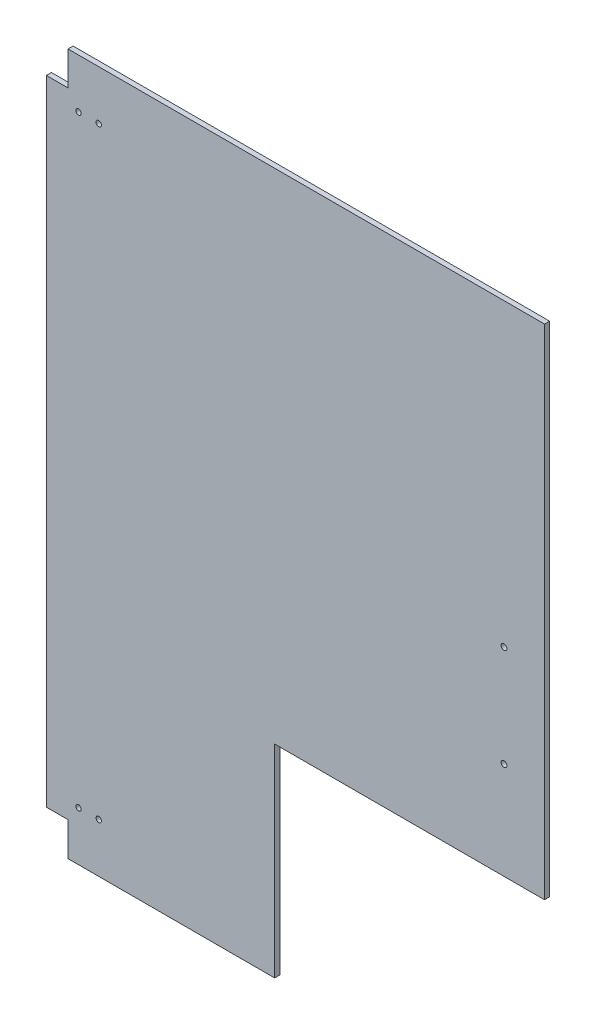
ISO-10303-21;
HEADER;
FILE_DESCRIPTION(('STEP AP214'),'2;1');
FILE_NAME('part.step','',(''),(''),'','','');
FILE_SCHEMA(('AUTOMOTIVE_DESIGN { 1 0 10303 214 1 1 1 1 }'));
ENDSEC;
DATA;
#1=APPLICATION_CONTEXT('core data for automotive mechanical design processes');
#2=APPLICATION_PROTOCOL_DEFINITION('international standard','automotive_design',2000,#1);
#3=PRODUCT_CONTEXT('',#1,'mechanical');
#4=PRODUCT('Part','Part','',(#3));
#5=PRODUCT_RELATED_PRODUCT_CATEGORY('part','',(#4));
#6=PRODUCT_DEFINITION_FORMATION('','',#4);
#7=PRODUCT_DEFINITION_CONTEXT('part definition',#1,'design');
#8=PRODUCT_DEFINITION('design','',#6,#7);
#9=PRODUCT_DEFINITION_SHAPE('','',#8);
#10=(LENGTH_UNIT() NAMED_UNIT(*) SI_UNIT(.MILLI.,.METRE.));
#11=(NAMED_UNIT(*) PLANE_ANGLE_UNIT() SI_UNIT($,.RADIAN.));
#12=(NAMED_UNIT(*) SI_UNIT($,.STERADIAN.) SOLID_ANGLE_UNIT());
#13=UNCERTAINTY_MEASURE_WITH_UNIT(LENGTH_MEASURE(1.E-05),#10,'distance_accuracy_value','');
#14=(GEOMETRIC_REPRESENTATION_CONTEXT(3) GLOBAL_UNCERTAINTY_ASSIGNED_CONTEXT((#13)) GLOBAL_UNIT_ASSIGNED_CONTEXT((#10,
#11,#12)) REPRESENTATION_CONTEXT('',''));
#15=CARTESIAN_POINT('',(0.,0.,0.));
#16=DIRECTION('',(0.,0.,1.));
#17=DIRECTION('',(1.,0.,0.));
#18=AXIS2_PLACEMENT_3D('',#15,#16,#17);
#19=CARTESIAN_POINT('',(0.,0.,3.));
#20=DIRECTION('',(0.,0.,-1.));
#21=DIRECTION('',(-1.,0.,0.));
#22=AXIS2_PLACEMENT_3D('',#19,#20,#21);
#23=PLANE('',#22);
#24=CARTESIAN_POINT('',(271.,238.45,3.));
#25=DIRECTION('',(0.,0.,1.));
#26=DIRECTION('',(1.,0.,0.));
#27=AXIS2_PLACEMENT_3D('',#24,#25,#26);
#28=CIRCLE('',#27,1.69999999999998);
#29=CARTESIAN_POINT('',(272.7,238.45,3.));
#30=VERTEX_POINT('',#29);
#31=EDGE_CURVE('E175',#30,#30,#28,.T.);
#32=ORIENTED_EDGE('',*,*,#31,.F.);
#33=EDGE_LOOP('',(#32));
#34=FACE_BOUND('',#33,.T.);
#35=CARTESIAN_POINT('',(271.,178.45,3.));
#36=DIRECTION('',(0.,0.,1.));
#37=DIRECTION('',(1.,0.,0.));
#38=AXIS2_PLACEMENT_3D('',#35,#36,#37);
#39=CIRCLE('',#38,1.69999999999998);
#40=CARTESIAN_POINT('',(272.7,178.45,3.));
#41=VERTEX_POINT('',#40);
#42=EDGE_CURVE('E221',#41,#41,#39,.T.);
#43=ORIENTED_EDGE('',*,*,#42,.F.);
#44=EDGE_LOOP('',(#43));
#45=FACE_BOUND('',#44,.T.);
#46=CARTESIAN_POINT('',(18.9999999999999,386.9,3.));
#47=DIRECTION('',(0.,0.,1.));
#48=DIRECTION('',(1.,0.,0.));
#49=AXIS2_PLACEMENT_3D('',#46,#47,#48);
#50=CIRCLE('',#49,1.6);
#51=CARTESIAN_POINT('',(20.5999999999999,386.9,3.));
#52=VERTEX_POINT('',#51);
#53=EDGE_CURVE('E225',#52,#52,#50,.T.);
#54=ORIENTED_EDGE('',*,*,#53,.F.);
#55=EDGE_LOOP('',(#54));
#56=FACE_BOUND('',#55,.T.);
#57=CARTESIAN_POINT('',(30.9999999999999,386.9,3.));
#58=DIRECTION('',(0.,0.,1.));
#59=DIRECTION('',(1.,0.,0.));
#60=AXIS2_PLACEMENT_3D('',#57,#58,#59);
#61=CIRCLE('',#60,1.6);
#62=CARTESIAN_POINT('',(32.5999999999999,386.9,3.));
#63=VERTEX_POINT('',#62);
#64=EDGE_CURVE('E229',#63,#63,#61,.T.);
#65=ORIENTED_EDGE('',*,*,#64,.F.);
#66=EDGE_LOOP('',(#65));
#67=FACE_BOUND('',#66,.T.);
#68=CARTESIAN_POINT('',(18.9999999999999,30.,3.));
#69=DIRECTION('',(0.,0.,1.));
#70=DIRECTION('',(1.,0.,0.));
#71=AXIS2_PLACEMENT_3D('',#68,#69,#70);
#72=CIRCLE('',#71,1.6);
#73=CARTESIAN_POINT('',(20.5999999999999,30.,3.));
#74=VERTEX_POINT('',#73);
#75=EDGE_CURVE('E233',#74,#74,#72,.T.);
#76=ORIENTED_EDGE('',*,*,#75,.F.);
#77=EDGE_LOOP('',(#76));
#78=FACE_BOUND('',#77,.T.);
#79=DIRECTION('',(1.,0.,0.));
#80=VECTOR('',#79,1.);
#81=CARTESIAN_POINT('',(0.,120.8,3.));
#82=LINE('',#81,#80);
#83=CARTESIAN_POINT('',(135.2,120.8,3.));
#84=VERTEX_POINT('',#83);
#85=CARTESIAN_POINT('',(295.,120.8,3.));
#86=VERTEX_POINT('',#85);
#87=EDGE_CURVE('E107',#84,#86,#82,.T.);
#88=ORIENTED_EDGE('',*,*,#87,.T.);
#89=DIRECTION('',(0.,-1.,0.));
#90=VECTOR('',#89,1.);
#91=CARTESIAN_POINT('',(295.,416.9,3.));
#92=LINE('',#91,#90);
#93=CARTESIAN_POINT('',(295.,416.1,3.));
#94=VERTEX_POINT('',#93);
#95=EDGE_CURVE('E94',#94,#86,#92,.T.);
#96=ORIENTED_EDGE('',*,*,#95,.F.);
#97=DIRECTION('',(-1.,0.,0.));
#98=VECTOR('',#97,1.);
#99=CARTESIAN_POINT('',(0.,416.1,3.));
#100=LINE('',#99,#98);
#101=CARTESIAN_POINT('',(12.7999999999999,416.1,3.));
#102=VERTEX_POINT('',#101);
#103=EDGE_CURVE('E103',#94,#102,#100,.T.);
#104=ORIENTED_EDGE('',*,*,#103,.T.);
#105=DIRECTION('',(0.,1.,0.));
#106=VECTOR('',#105,1.);
#107=CARTESIAN_POINT('',(12.7999999999999,416.9,3.));
#108=LINE('',#107,#106);
#109=CARTESIAN_POINT('',(12.7999999999999,396.1,3.));
#110=VERTEX_POINT('',#109);
#111=EDGE_CURVE('E124',#110,#102,#108,.T.);
#112=ORIENTED_EDGE('',*,*,#111,.F.);
#113=DIRECTION('',(1.,0.,0.));
#114=VECTOR('',#113,1.);
#115=CARTESIAN_POINT('',(-1.0842021724855E-13,396.1,3.));
#116=LINE('',#115,#114);
#117=CARTESIAN_POINT('',(-1.05483171037185E-13,396.1,3.));
#118=VERTEX_POINT('',#117);
#119=EDGE_CURVE('E126',#118,#110,#116,.T.);
#120=ORIENTED_EDGE('',*,*,#119,.F.);
#121=DIRECTION('',(0.,-1.,0.));
#122=VECTOR('',#121,1.);
#123=CARTESIAN_POINT('',(0.,0.,3.));
#124=LINE('',#123,#122);
#125=CARTESIAN_POINT('',(0.,20.8,3.));
#126=VERTEX_POINT('',#125);
#127=EDGE_CURVE('E140',#118,#126,#124,.T.);
#128=ORIENTED_EDGE('',*,*,#127,.T.);
#129=DIRECTION('',(-1.,0.,0.));
#130=VECTOR('',#129,1.);
#131=CARTESIAN_POINT('',(0.,20.8,3.));
#132=LINE('',#131,#130);
#133=CARTESIAN_POINT('',(12.8,20.8,3.));
#134=VERTEX_POINT('',#133);
#135=EDGE_CURVE('E166',#134,#126,#132,.T.);
#136=ORIENTED_EDGE('',*,*,#135,.F.);
#137=DIRECTION('',(0.,1.,0.));
#138=VECTOR('',#137,1.);
#139=CARTESIAN_POINT('',(12.8,0.,3.));
#140=LINE('',#139,#138);
#141=CARTESIAN_POINT('',(12.8,0.8,3.));
#142=VERTEX_POINT('',#141);
#143=EDGE_CURVE('E129',#142,#134,#140,.T.);
#144=ORIENTED_EDGE('',*,*,#143,.F.);
#145=DIRECTION('',(1.,0.,0.));
#146=VECTOR('',#145,1.);
#147=CARTESIAN_POINT('',(0.,0.8,3.));
#148=LINE('',#147,#146);
#149=CARTESIAN_POINT('',(135.2,0.8,3.));
#150=VERTEX_POINT('',#149);
#151=EDGE_CURVE('E143',#142,#150,#148,.T.);
#152=ORIENTED_EDGE('',*,*,#151,.T.);
#153=DIRECTION('',(0.,1.,0.));
#154=VECTOR('',#153,1.);
#155=CARTESIAN_POINT('',(135.2,0.,3.));
#156=LINE('',#155,#154);
#157=EDGE_CURVE('E118',#150,#84,#156,.T.);
#158=ORIENTED_EDGE('',*,*,#157,.T.);
#159=EDGE_LOOP('',(#88,#96,#104,#112,#120,#128,#136,#144,#152,#158));
#160=FACE_BOUND('',#159,.T.);
#161=CARTESIAN_POINT('',(30.9999999999999,30.,3.));
#162=DIRECTION('',(0.,0.,1.));
#163=DIRECTION('',(1.,0.,0.));
#164=AXIS2_PLACEMENT_3D('',#161,#162,#163);
#165=CIRCLE('',#164,1.6);
#166=CARTESIAN_POINT('',(32.5999999999999,30.,3.));
#167=VERTEX_POINT('',#166);
#168=EDGE_CURVE('E237',#167,#167,#165,.T.);
#169=ORIENTED_EDGE('',*,*,#168,.F.);
#170=EDGE_LOOP('',(#169));
#171=FACE_BOUND('',#170,.T.);
#172=ADVANCED_FACE('F42',(#34,#45,#56,#67,#78,#160,#171),#23,.F.);
#173=CARTESIAN_POINT('',(0.,0.,3.));
#174=DIRECTION('',(1.,0.,0.));
#175=DIRECTION('',(0.,1.,0.));
#176=AXIS2_PLACEMENT_3D('',#173,#174,#175);
#177=PLANE('',#176);
#178=ORIENTED_EDGE('',*,*,#127,.F.);
#179=DIRECTION('',(0.,0.,-1.));
#180=VECTOR('',#179,1.);
#181=CARTESIAN_POINT('',(-1.05483171037185E-13,396.1,3.));
#182=LINE('',#181,#180);
#183=CARTESIAN_POINT('',(-1.05483171037185E-13,396.1,0.));
#184=VERTEX_POINT('',#183);
#185=EDGE_CURVE('E130',#118,#184,#182,.T.);
#186=ORIENTED_EDGE('',*,*,#185,.T.);
#187=DIRECTION('',(0.,-1.,0.));
#188=VECTOR('',#187,1.);
#189=CARTESIAN_POINT('',(0.,0.,0.));
#190=LINE('',#189,#188);
#191=CARTESIAN_POINT('',(0.,20.8,0.));
#192=VERTEX_POINT('',#191);
#193=EDGE_CURVE('E133',#184,#192,#190,.T.);
#194=ORIENTED_EDGE('',*,*,#193,.T.);
#195=DIRECTION('',(0.,0.,1.));
#196=VECTOR('',#195,1.);
#197=CARTESIAN_POINT('',(0.,20.8,3.));
#198=LINE('',#197,#196);
#199=EDGE_CURVE('E134',#192,#126,#198,.T.);
#200=ORIENTED_EDGE('',*,*,#199,.T.);
#201=EDGE_LOOP('',(#178,#186,#194,#200));
#202=FACE_BOUND('',#201,.T.);
#203=ADVANCED_FACE('F186',(#202),#177,.F.);
#204=CARTESIAN_POINT('',(0.,0.8,3.));
#205=DIRECTION('',(0.,1.,0.));
#206=DIRECTION('',(0.,0.,1.));
#207=AXIS2_PLACEMENT_3D('',#204,#205,#206);
#208=PLANE('',#207);
#209=ORIENTED_EDGE('',*,*,#151,.F.);
#210=DIRECTION('',(0.,0.,1.));
#211=VECTOR('',#210,1.);
#212=CARTESIAN_POINT('',(12.8,0.8,-7.));
#213=LINE('',#212,#211);
#214=CARTESIAN_POINT('',(12.8,0.8,0.));
#215=VERTEX_POINT('',#214);
#216=EDGE_CURVE('E169',#215,#142,#213,.T.);
#217=ORIENTED_EDGE('',*,*,#216,.F.);
#218=DIRECTION('',(1.,0.,0.));
#219=VECTOR('',#218,1.);
#220=CARTESIAN_POINT('',(0.,0.8,0.));
#221=LINE('',#220,#219);
#222=CARTESIAN_POINT('',(135.2,0.8,0.));
#223=VERTEX_POINT('',#222);
#224=EDGE_CURVE('E151',#215,#223,#221,.T.);
#225=ORIENTED_EDGE('',*,*,#224,.T.);
#226=DIRECTION('',(0.,0.,-1.));
#227=VECTOR('',#226,1.);
#228=CARTESIAN_POINT('',(135.2,0.8,3.));
#229=LINE('',#228,#227);
#230=EDGE_CURVE('E116',#150,#223,#229,.T.);
#231=ORIENTED_EDGE('',*,*,#230,.F.);
#232=EDGE_LOOP('',(#209,#217,#225,#231));
#233=FACE_BOUND('',#232,.T.);
#234=ADVANCED_FACE('F212',(#233),#208,.F.);
#235=CARTESIAN_POINT('',(135.2,0.,3.));
#236=DIRECTION('',(-1.,0.,0.));
#237=DIRECTION('',(0.,0.,1.));
#238=AXIS2_PLACEMENT_3D('',#235,#236,#237);
#239=PLANE('',#238);
#240=DIRECTION('',(0.,1.,0.));
#241=VECTOR('',#240,1.);
#242=CARTESIAN_POINT('',(135.2,0.,0.));
#243=LINE('',#242,#241);
#244=CARTESIAN_POINT('',(135.2,120.8,0.));
#245=VERTEX_POINT('',#244);
#246=EDGE_CURVE('E146',#223,#245,#243,.T.);
#247=ORIENTED_EDGE('',*,*,#246,.T.);
#248=DIRECTION('',(0.,0.,-1.));
#249=VECTOR('',#248,1.);
#250=CARTESIAN_POINT('',(135.2,120.8,3.));
#251=LINE('',#250,#249);
#252=EDGE_CURVE('E113',#84,#245,#251,.T.);
#253=ORIENTED_EDGE('',*,*,#252,.F.);
#254=ORIENTED_EDGE('',*,*,#157,.F.);
#255=ORIENTED_EDGE('',*,*,#230,.T.);
#256=EDGE_LOOP('',(#247,#253,#254,#255));
#257=FACE_BOUND('',#256,.T.);
#258=ADVANCED_FACE('F291',(#257),#239,.F.);
#259=CARTESIAN_POINT('',(300.,120.8,3.));
#260=DIRECTION('',(0.,1.,0.));
#261=DIRECTION('',(0.,0.,1.));
#262=AXIS2_PLACEMENT_3D('',#259,#260,#261);
#263=PLANE('',#262);
#264=DIRECTION('',(1.,0.,0.));
#265=VECTOR('',#264,1.);
#266=CARTESIAN_POINT('',(0.,120.8,0.));
#267=LINE('',#266,#265);
#268=CARTESIAN_POINT('',(295.,120.8,0.));
#269=VERTEX_POINT('',#268);
#270=EDGE_CURVE('E141',#245,#269,#267,.T.);
#271=ORIENTED_EDGE('',*,*,#270,.T.);
#272=DIRECTION('',(0.,0.,1.));
#273=VECTOR('',#272,1.);
#274=CARTESIAN_POINT('',(295.,120.8,3.));
#275=LINE('',#274,#273);
#276=EDGE_CURVE('E60',#269,#86,#275,.T.);
#277=ORIENTED_EDGE('',*,*,#276,.T.);
#278=ORIENTED_EDGE('',*,*,#87,.F.);
#279=ORIENTED_EDGE('',*,*,#252,.T.);
#280=EDGE_LOOP('',(#271,#277,#278,#279));
#281=FACE_BOUND('',#280,.T.);
#282=ADVANCED_FACE('F288',(#281),#263,.F.);
#283=CARTESIAN_POINT('',(-1.11022302462516E-13,416.1,3.));
#284=DIRECTION('',(0.,-1.,0.));
#285=DIRECTION('',(0.,0.,-1.));
#286=AXIS2_PLACEMENT_3D('',#283,#284,#285);
#287=PLANE('',#286);
#288=ORIENTED_EDGE('',*,*,#103,.F.);
#289=DIRECTION('',(0.,0.,1.));
#290=VECTOR('',#289,1.);
#291=CARTESIAN_POINT('',(295.,416.1,-7.));
#292=LINE('',#291,#290);
#293=CARTESIAN_POINT('',(295.,416.1,0.));
#294=VERTEX_POINT('',#293);
#295=EDGE_CURVE('E46',#294,#94,#292,.T.);
#296=ORIENTED_EDGE('',*,*,#295,.F.);
#297=DIRECTION('',(-1.,0.,0.));
#298=VECTOR('',#297,1.);
#299=CARTESIAN_POINT('',(0.,416.1,0.));
#300=LINE('',#299,#298);
#301=CARTESIAN_POINT('',(12.7999999999999,416.1,0.));
#302=VERTEX_POINT('',#301);
#303=EDGE_CURVE('E139',#294,#302,#300,.T.);
#304=ORIENTED_EDGE('',*,*,#303,.T.);
#305=DIRECTION('',(0.,0.,1.));
#306=VECTOR('',#305,1.);
#307=CARTESIAN_POINT('',(12.7999999999999,416.1,3.));
#308=LINE('',#307,#306);
#309=EDGE_CURVE('E112',#302,#102,#308,.T.);
#310=ORIENTED_EDGE('',*,*,#309,.T.);
#311=EDGE_LOOP('',(#288,#296,#304,#310));
#312=FACE_BOUND('',#311,.T.);
#313=ADVANCED_FACE('F110',(#312),#287,.F.);
#314=CARTESIAN_POINT('',(0.,0.,0.));
#315=DIRECTION('',(0.,0.,-1.));
#316=DIRECTION('',(-1.,0.,0.));
#317=AXIS2_PLACEMENT_3D('',#314,#315,#316);
#318=PLANE('',#317);
#319=DIRECTION('',(0.,1.,0.));
#320=VECTOR('',#319,1.);
#321=CARTESIAN_POINT('',(295.,0.,0.));
#322=LINE('',#321,#320);
#323=EDGE_CURVE('E12',#269,#294,#322,.T.);
#324=ORIENTED_EDGE('',*,*,#323,.F.);
#325=ORIENTED_EDGE('',*,*,#270,.F.);
#326=ORIENTED_EDGE('',*,*,#246,.F.);
#327=ORIENTED_EDGE('',*,*,#224,.F.);
#328=DIRECTION('',(0.,-1.,0.));
#329=VECTOR('',#328,1.);
#330=CARTESIAN_POINT('',(12.8,0.,0.));
#331=LINE('',#330,#329);
#332=CARTESIAN_POINT('',(12.8,20.8,0.));
#333=VERTEX_POINT('',#332);
#334=EDGE_CURVE('E159',#333,#215,#331,.T.);
#335=ORIENTED_EDGE('',*,*,#334,.F.);
#336=DIRECTION('',(1.,0.,0.));
#337=VECTOR('',#336,1.);
#338=CARTESIAN_POINT('',(0.,20.8,0.));
#339=LINE('',#338,#337);
#340=EDGE_CURVE('E137',#192,#333,#339,.T.);
#341=ORIENTED_EDGE('',*,*,#340,.F.);
#342=ORIENTED_EDGE('',*,*,#193,.F.);
#343=DIRECTION('',(-1.,0.,0.));
#344=VECTOR('',#343,1.);
#345=CARTESIAN_POINT('',(0.,396.1,0.));
#346=LINE('',#345,#344);
#347=CARTESIAN_POINT('',(12.7999999999999,396.1,0.));
#348=VERTEX_POINT('',#347);
#349=EDGE_CURVE('E135',#348,#184,#346,.T.);
#350=ORIENTED_EDGE('',*,*,#349,.F.);
#351=DIRECTION('',(0.,-1.,0.));
#352=VECTOR('',#351,1.);
#353=CARTESIAN_POINT('',(12.7999999999999,0.,0.));
#354=LINE('',#353,#352);
#355=EDGE_CURVE('E52',#302,#348,#354,.T.);
#356=ORIENTED_EDGE('',*,*,#355,.F.);
#357=ORIENTED_EDGE('',*,*,#303,.F.);
#358=EDGE_LOOP('',(#324,#325,#326,#327,#335,#341,#342,#350,#356,#357));
#359=FACE_BOUND('',#358,.T.);
#360=CARTESIAN_POINT('',(271.,238.45,0.));
#361=DIRECTION('',(0.,0.,-1.));
#362=DIRECTION('',(-1.,0.,0.));
#363=AXIS2_PLACEMENT_3D('',#360,#361,#362);
#364=CIRCLE('',#363,1.69999999999998);
#365=CARTESIAN_POINT('',(269.3,238.45,0.));
#366=VERTEX_POINT('',#365);
#367=EDGE_CURVE('E218',#366,#366,#364,.T.);
#368=ORIENTED_EDGE('',*,*,#367,.F.);
#369=EDGE_LOOP('',(#368));
#370=FACE_BOUND('',#369,.T.);
#371=CARTESIAN_POINT('',(271.,178.45,0.));
#372=DIRECTION('',(0.,0.,-1.));
#373=DIRECTION('',(-1.,0.,0.));
#374=AXIS2_PLACEMENT_3D('',#371,#372,#373);
#375=CIRCLE('',#374,1.69999999999998);
#376=CARTESIAN_POINT('',(269.3,178.45,0.));
#377=VERTEX_POINT('',#376);
#378=EDGE_CURVE('E222',#377,#377,#375,.T.);
#379=ORIENTED_EDGE('',*,*,#378,.F.);
#380=EDGE_LOOP('',(#379));
#381=FACE_BOUND('',#380,.T.);
#382=CARTESIAN_POINT('',(18.9999999999999,386.9,0.));
#383=DIRECTION('',(0.,0.,-1.));
#384=DIRECTION('',(-1.,0.,0.));
#385=AXIS2_PLACEMENT_3D('',#382,#383,#384);
#386=CIRCLE('',#385,1.6);
#387=CARTESIAN_POINT('',(17.3999999999999,386.9,0.));
#388=VERTEX_POINT('',#387);
#389=EDGE_CURVE('E226',#388,#388,#386,.T.);
#390=ORIENTED_EDGE('',*,*,#389,.F.);
#391=EDGE_LOOP('',(#390));
#392=FACE_BOUND('',#391,.T.);
#393=CARTESIAN_POINT('',(30.9999999999999,386.9,0.));
#394=DIRECTION('',(0.,0.,-1.));
#395=DIRECTION('',(-1.,0.,0.));
#396=AXIS2_PLACEMENT_3D('',#393,#394,#395);
#397=CIRCLE('',#396,1.6);
#398=CARTESIAN_POINT('',(29.3999999999999,386.9,0.));
#399=VERTEX_POINT('',#398);
#400=EDGE_CURVE('E230',#399,#399,#397,.T.);
#401=ORIENTED_EDGE('',*,*,#400,.F.);
#402=EDGE_LOOP('',(#401));
#403=FACE_BOUND('',#402,.T.);
#404=CARTESIAN_POINT('',(18.9999999999999,30.,0.));
#405=DIRECTION('',(0.,0.,-1.));
#406=DIRECTION('',(-1.,0.,0.));
#407=AXIS2_PLACEMENT_3D('',#404,#405,#406);
#408=CIRCLE('',#407,1.6);
#409=CARTESIAN_POINT('',(17.3999999999999,30.,0.));
#410=VERTEX_POINT('',#409);
#411=EDGE_CURVE('E234',#410,#410,#408,.T.);
#412=ORIENTED_EDGE('',*,*,#411,.F.);
#413=EDGE_LOOP('',(#412));
#414=FACE_BOUND('',#413,.T.);
#415=CARTESIAN_POINT('',(30.9999999999999,30.,0.));
#416=DIRECTION('',(0.,0.,-1.));
#417=DIRECTION('',(-1.,0.,0.));
#418=AXIS2_PLACEMENT_3D('',#415,#416,#417);
#419=CIRCLE('',#418,1.6);
#420=CARTESIAN_POINT('',(29.3999999999999,30.,0.));
#421=VERTEX_POINT('',#420);
#422=EDGE_CURVE('E215',#421,#421,#419,.T.);
#423=ORIENTED_EDGE('',*,*,#422,.F.);
#424=EDGE_LOOP('',(#423));
#425=FACE_BOUND('',#424,.T.);
#426=ADVANCED_FACE('F197',(#359,#370,#381,#392,#403,#414,#425),#318,.T.);
#427=CARTESIAN_POINT('',(0.,20.8,-7.));
#428=DIRECTION('',(0.,1.,0.));
#429=DIRECTION('',(-1.,0.,0.));
#430=AXIS2_PLACEMENT_3D('',#427,#428,#429);
#431=PLANE('',#430);
#432=ORIENTED_EDGE('',*,*,#340,.T.);
#433=DIRECTION('',(0.,0.,1.));
#434=VECTOR('',#433,1.);
#435=CARTESIAN_POINT('',(12.8,20.8,-7.));
#436=LINE('',#435,#434);
#437=EDGE_CURVE('E154',#333,#134,#436,.T.);
#438=ORIENTED_EDGE('',*,*,#437,.T.);
#439=ORIENTED_EDGE('',*,*,#135,.T.);
#440=ORIENTED_EDGE('',*,*,#199,.F.);
#441=EDGE_LOOP('',(#432,#438,#439,#440));
#442=FACE_BOUND('',#441,.T.);
#443=ADVANCED_FACE('F193',(#442),#431,.F.);
#444=CARTESIAN_POINT('',(12.8,0.,-7.));
#445=DIRECTION('',(1.,0.,0.));
#446=DIRECTION('',(0.,1.,0.));
#447=AXIS2_PLACEMENT_3D('',#444,#445,#446);
#448=PLANE('',#447);
#449=ORIENTED_EDGE('',*,*,#334,.T.);
#450=ORIENTED_EDGE('',*,*,#216,.T.);
#451=ORIENTED_EDGE('',*,*,#143,.T.);
#452=ORIENTED_EDGE('',*,*,#437,.F.);
#453=EDGE_LOOP('',(#449,#450,#451,#452));
#454=FACE_BOUND('',#453,.T.);
#455=ADVANCED_FACE('F207',(#454),#448,.F.);
#456=CARTESIAN_POINT('',(-1.0842021724855E-13,396.1,-7.));
#457=DIRECTION('',(0.,-1.,0.));
#458=DIRECTION('',(0.,0.,-1.));
#459=AXIS2_PLACEMENT_3D('',#456,#457,#458);
#460=PLANE('',#459);
#461=ORIENTED_EDGE('',*,*,#119,.T.);
#462=DIRECTION('',(0.,0.,1.));
#463=VECTOR('',#462,1.);
#464=CARTESIAN_POINT('',(12.7999999999999,396.1,-7.));
#465=LINE('',#464,#463);
#466=EDGE_CURVE('E122',#348,#110,#465,.T.);
#467=ORIENTED_EDGE('',*,*,#466,.F.);
#468=ORIENTED_EDGE('',*,*,#349,.T.);
#469=ORIENTED_EDGE('',*,*,#185,.F.);
#470=EDGE_LOOP('',(#461,#467,#468,#469));
#471=FACE_BOUND('',#470,.T.);
#472=ADVANCED_FACE('F44',(#471),#460,.F.);
#473=CARTESIAN_POINT('',(12.7999999999999,416.9,-7.));
#474=DIRECTION('',(1.,0.,0.));
#475=DIRECTION('',(0.,0.,-1.));
#476=AXIS2_PLACEMENT_3D('',#473,#474,#475);
#477=PLANE('',#476);
#478=ORIENTED_EDGE('',*,*,#355,.T.);
#479=ORIENTED_EDGE('',*,*,#466,.T.);
#480=ORIENTED_EDGE('',*,*,#111,.T.);
#481=ORIENTED_EDGE('',*,*,#309,.F.);
#482=EDGE_LOOP('',(#478,#479,#480,#481));
#483=FACE_BOUND('',#482,.T.);
#484=ADVANCED_FACE('F177',(#483),#477,.F.);
#485=CARTESIAN_POINT('',(30.9999999999999,30.,3.));
#486=DIRECTION('',(0.,0.,1.));
#487=DIRECTION('',(1.,0.,0.));
#488=AXIS2_PLACEMENT_3D('',#485,#486,#487);
#489=CYLINDRICAL_SURFACE('',#488,1.6);
#490=ORIENTED_EDGE('',*,*,#422,.T.);
#491=EDGE_LOOP('',(#490));
#492=FACE_BOUND('',#491,.T.);
#493=ORIENTED_EDGE('',*,*,#168,.T.);
#494=EDGE_LOOP('',(#493));
#495=FACE_BOUND('',#494,.T.);
#496=ADVANCED_FACE('F270',(#492,#495),#489,.F.);
#497=CARTESIAN_POINT('',(18.9999999999999,30.,3.));
#498=DIRECTION('',(0.,0.,1.));
#499=DIRECTION('',(1.,0.,0.));
#500=AXIS2_PLACEMENT_3D('',#497,#498,#499);
#501=CYLINDRICAL_SURFACE('',#500,1.6);
#502=ORIENTED_EDGE('',*,*,#411,.T.);
#503=EDGE_LOOP('',(#502));
#504=FACE_BOUND('',#503,.T.);
#505=ORIENTED_EDGE('',*,*,#75,.T.);
#506=EDGE_LOOP('',(#505));
#507=FACE_BOUND('',#506,.T.);
#508=ADVANCED_FACE('F267',(#504,#507),#501,.F.);
#509=CARTESIAN_POINT('',(30.9999999999999,386.9,3.));
#510=DIRECTION('',(0.,0.,1.));
#511=DIRECTION('',(1.,0.,0.));
#512=AXIS2_PLACEMENT_3D('',#509,#510,#511);
#513=CYLINDRICAL_SURFACE('',#512,1.6);
#514=ORIENTED_EDGE('',*,*,#400,.T.);
#515=EDGE_LOOP('',(#514));
#516=FACE_BOUND('',#515,.T.);
#517=ORIENTED_EDGE('',*,*,#64,.T.);
#518=EDGE_LOOP('',(#517));
#519=FACE_BOUND('',#518,.T.);
#520=ADVANCED_FACE('F269',(#516,#519),#513,.F.);
#521=CARTESIAN_POINT('',(18.9999999999999,386.9,3.));
#522=DIRECTION('',(0.,0.,1.));
#523=DIRECTION('',(1.,0.,0.));
#524=AXIS2_PLACEMENT_3D('',#521,#522,#523);
#525=CYLINDRICAL_SURFACE('',#524,1.6);
#526=ORIENTED_EDGE('',*,*,#389,.T.);
#527=EDGE_LOOP('',(#526));
#528=FACE_BOUND('',#527,.T.);
#529=ORIENTED_EDGE('',*,*,#53,.T.);
#530=EDGE_LOOP('',(#529));
#531=FACE_BOUND('',#530,.T.);
#532=ADVANCED_FACE('F277',(#528,#531),#525,.F.);
#533=CARTESIAN_POINT('',(271.,178.45,3.));
#534=DIRECTION('',(0.,0.,1.));
#535=DIRECTION('',(1.,0.,0.));
#536=AXIS2_PLACEMENT_3D('',#533,#534,#535);
#537=CYLINDRICAL_SURFACE('',#536,1.69999999999998);
#538=ORIENTED_EDGE('',*,*,#378,.T.);
#539=EDGE_LOOP('',(#538));
#540=FACE_BOUND('',#539,.T.);
#541=ORIENTED_EDGE('',*,*,#42,.T.);
#542=EDGE_LOOP('',(#541));
#543=FACE_BOUND('',#542,.T.);
#544=ADVANCED_FACE('F360',(#540,#543),#537,.F.);
#545=CARTESIAN_POINT('',(271.,238.45,3.));
#546=DIRECTION('',(0.,0.,1.));
#547=DIRECTION('',(1.,0.,0.));
#548=AXIS2_PLACEMENT_3D('',#545,#546,#547);
#549=CYLINDRICAL_SURFACE('',#548,1.69999999999998);
#550=ORIENTED_EDGE('',*,*,#367,.T.);
#551=EDGE_LOOP('',(#550));
#552=FACE_BOUND('',#551,.T.);
#553=ORIENTED_EDGE('',*,*,#31,.T.);
#554=EDGE_LOOP('',(#553));
#555=FACE_BOUND('',#554,.T.);
#556=ADVANCED_FACE('F254',(#552,#555),#549,.F.);
#557=CARTESIAN_POINT('',(295.,416.9,-7.));
#558=DIRECTION('',(-1.,0.,0.));
#559=DIRECTION('',(0.,-1.,0.));
#560=AXIS2_PLACEMENT_3D('',#557,#558,#559);
#561=PLANE('',#560);
#562=ORIENTED_EDGE('',*,*,#323,.T.);
#563=ORIENTED_EDGE('',*,*,#295,.T.);
#564=ORIENTED_EDGE('',*,*,#95,.T.);
#565=ORIENTED_EDGE('',*,*,#276,.F.);
#566=EDGE_LOOP('',(#562,#563,#564,#565));
#567=FACE_BOUND('',#566,.T.);
#568=ADVANCED_FACE('F95',(#567),#561,.F.);
#569=CLOSED_SHELL('',(#172,#203,#234,#258,#282,#313,#426,#443,#455,#472,#484,#496,#508,#520,
#532,#544,#556,#568));
#570=MANIFOLD_SOLID_BREP('B2',#569);
#571=ADVANCED_BREP_SHAPE_REPRESENTATION('',(#18,#570),#14);
#572=SHAPE_DEFINITION_REPRESENTATION(#9,#571);
ENDSEC;
END-ISO-10303-21;
